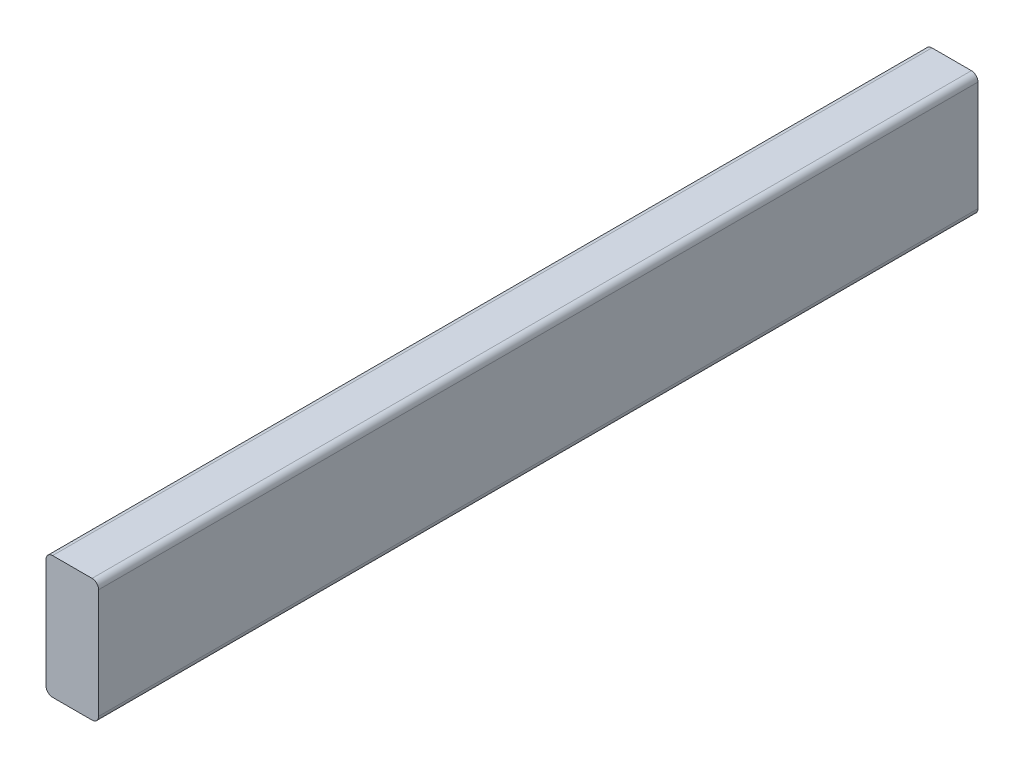
ISO-10303-21;
HEADER;
FILE_DESCRIPTION(('STEP AP214'),'2;1');
FILE_NAME('part.step','',(''),(''),'','','');
FILE_SCHEMA(('AUTOMOTIVE_DESIGN { 1 0 10303 214 1 1 1 1 }'));
ENDSEC;
DATA;
#1=APPLICATION_CONTEXT('core data for automotive mechanical design processes');
#2=APPLICATION_PROTOCOL_DEFINITION('international standard','automotive_design',2000,#1);
#3=PRODUCT_CONTEXT('',#1,'mechanical');
#4=PRODUCT('Part','Part','',(#3));
#5=PRODUCT_RELATED_PRODUCT_CATEGORY('part','',(#4));
#6=PRODUCT_DEFINITION_FORMATION('','',#4);
#7=PRODUCT_DEFINITION_CONTEXT('part definition',#1,'design');
#8=PRODUCT_DEFINITION('design','',#6,#7);
#9=PRODUCT_DEFINITION_SHAPE('','',#8);
#10=(LENGTH_UNIT() NAMED_UNIT(*) SI_UNIT(.MILLI.,.METRE.));
#11=(NAMED_UNIT(*) PLANE_ANGLE_UNIT() SI_UNIT($,.RADIAN.));
#12=(NAMED_UNIT(*) SI_UNIT($,.STERADIAN.) SOLID_ANGLE_UNIT());
#13=UNCERTAINTY_MEASURE_WITH_UNIT(LENGTH_MEASURE(1.E-05),#10,'distance_accuracy_value','');
#14=(GEOMETRIC_REPRESENTATION_CONTEXT(3) GLOBAL_UNCERTAINTY_ASSIGNED_CONTEXT((#13)) GLOBAL_UNIT_ASSIGNED_CONTEXT((#10,
#11,#12)) REPRESENTATION_CONTEXT('',''));
#15=CARTESIAN_POINT('',(0.,0.,0.));
#16=DIRECTION('',(0.,0.,1.));
#17=DIRECTION('',(1.,0.,0.));
#18=AXIS2_PLACEMENT_3D('',#15,#16,#17);
#19=CARTESIAN_POINT('',(-819.830594651005,100.80625,-733.389526516131));
#20=DIRECTION('',(-1.,0.,0.));
#21=DIRECTION('',(0.,0.,1.));
#22=AXIS2_PLACEMENT_3D('',#19,#20,#21);
#23=PLANE('',#22);
#24=DIRECTION('',(0.,1.,0.));
#25=VECTOR('',#24,1.);
#26=CARTESIAN_POINT('',(-819.830594651005,11.90625,-636.66920807166));
#27=LINE('',#26,#25);
#28=CARTESIAN_POINT('',(-819.830594651005,16.66875,-636.66920807166));
#29=VERTEX_POINT('',#28);
#30=CARTESIAN_POINT('',(-819.830594651005,96.04375,-636.66920807166));
#31=VERTEX_POINT('',#30);
#32=EDGE_CURVE('E107',#29,#31,#27,.T.);
#33=ORIENTED_EDGE('',*,*,#32,.F.);
#34=DIRECTION('',(0.,0.,1.));
#35=VECTOR('',#34,1.);
#36=CARTESIAN_POINT('',(-819.830594651005,16.66875,-733.389526516131));
#37=LINE('',#36,#35);
#38=CARTESIAN_POINT('',(-819.830594651005,16.66875,0.));
#39=VERTEX_POINT('',#38);
#40=EDGE_CURVE('E120',#29,#39,#37,.T.);
#41=ORIENTED_EDGE('',*,*,#40,.T.);
#42=DIRECTION('',(0.,-1.,0.));
#43=VECTOR('',#42,1.);
#44=CARTESIAN_POINT('',(-819.830594651005,100.80625,0.));
#45=LINE('',#44,#43);
#46=CARTESIAN_POINT('',(-819.830594651005,96.04375,0.));
#47=VERTEX_POINT('',#46);
#48=EDGE_CURVE('E170',#47,#39,#45,.T.);
#49=ORIENTED_EDGE('',*,*,#48,.F.);
#50=DIRECTION('',(0.,0.,1.));
#51=VECTOR('',#50,1.);
#52=CARTESIAN_POINT('',(-819.830594651005,96.04375,-733.389526516131));
#53=LINE('',#52,#51);
#54=EDGE_CURVE('E123',#47,#31,#53,.F.);
#55=ORIENTED_EDGE('',*,*,#54,.T.);
#56=EDGE_LOOP('',(#33,#41,#49,#55));
#57=FACE_BOUND('',#56,.T.);
#58=ADVANCED_FACE('F37',(#57),#23,.T.);
#59=CARTESIAN_POINT('',(-819.830594651005,100.80625,-733.389526516131));
#60=DIRECTION('',(0.,1.,0.));
#61=DIRECTION('',(0.,0.,1.));
#62=AXIS2_PLACEMENT_3D('',#59,#60,#61);
#63=PLANE('',#62);
#64=DIRECTION('',(1.,0.,0.));
#65=VECTOR('',#64,1.);
#66=CARTESIAN_POINT('',(-819.830594651005,100.80625,-636.66920807166));
#67=LINE('',#66,#65);
#68=CARTESIAN_POINT('',(-815.068094651005,100.80625,-636.66920807166));
#69=VERTEX_POINT('',#68);
#70=CARTESIAN_POINT('',(-786.493094651005,100.80625,-636.66920807166));
#71=VERTEX_POINT('',#70);
#72=EDGE_CURVE('E124',#69,#71,#67,.T.);
#73=ORIENTED_EDGE('',*,*,#72,.F.);
#74=DIRECTION('',(0.,0.,1.));
#75=VECTOR('',#74,1.);
#76=CARTESIAN_POINT('',(-815.068094651005,100.80625,-733.389526516131));
#77=LINE('',#76,#75);
#78=CARTESIAN_POINT('',(-815.068094651005,100.80625,0.));
#79=VERTEX_POINT('',#78);
#80=EDGE_CURVE('E11',#69,#79,#77,.T.);
#81=ORIENTED_EDGE('',*,*,#80,.T.);
#82=DIRECTION('',(-1.,0.,0.));
#83=VECTOR('',#82,1.);
#84=CARTESIAN_POINT('',(-819.830594651005,100.80625,0.));
#85=LINE('',#84,#83);
#86=CARTESIAN_POINT('',(-786.493094651005,100.80625,0.));
#87=VERTEX_POINT('',#86);
#88=EDGE_CURVE('E125',#87,#79,#85,.T.);
#89=ORIENTED_EDGE('',*,*,#88,.F.);
#90=DIRECTION('',(0.,0.,1.));
#91=VECTOR('',#90,1.);
#92=CARTESIAN_POINT('',(-786.493094651005,100.80625,-733.389526516131));
#93=LINE('',#92,#91);
#94=EDGE_CURVE('E45',#87,#71,#93,.F.);
#95=ORIENTED_EDGE('',*,*,#94,.T.);
#96=EDGE_LOOP('',(#73,#81,#89,#95));
#97=FACE_BOUND('',#96,.T.);
#98=ADVANCED_FACE('F154',(#97),#63,.T.);
#99=CARTESIAN_POINT('',(-781.730594651005,100.80625,-733.389526516131));
#100=DIRECTION('',(1.,0.,0.));
#101=DIRECTION('',(0.,0.,-1.));
#102=AXIS2_PLACEMENT_3D('',#99,#100,#101);
#103=PLANE('',#102);
#104=DIRECTION('',(0.,1.,0.));
#105=VECTOR('',#104,1.);
#106=CARTESIAN_POINT('',(-781.730594651005,100.80625,0.));
#107=LINE('',#106,#105);
#108=CARTESIAN_POINT('',(-781.730594651005,16.66875,0.));
#109=VERTEX_POINT('',#108);
#110=CARTESIAN_POINT('',(-781.730594651005,96.04375,0.));
#111=VERTEX_POINT('',#110);
#112=EDGE_CURVE('E163',#109,#111,#107,.T.);
#113=ORIENTED_EDGE('',*,*,#112,.F.);
#114=DIRECTION('',(0.,0.,1.));
#115=VECTOR('',#114,1.);
#116=CARTESIAN_POINT('',(-781.730594651005,16.66875,-733.389526516131));
#117=LINE('',#116,#115);
#118=CARTESIAN_POINT('',(-781.730594651005,16.66875,-636.66920807166));
#119=VERTEX_POINT('',#118);
#120=EDGE_CURVE('E52',#109,#119,#117,.F.);
#121=ORIENTED_EDGE('',*,*,#120,.T.);
#122=DIRECTION('',(0.,-1.,0.));
#123=VECTOR('',#122,1.);
#124=CARTESIAN_POINT('',(-781.730594651005,11.90625,-636.66920807166));
#125=LINE('',#124,#123);
#126=CARTESIAN_POINT('',(-781.730594651005,96.04375,-636.66920807166));
#127=VERTEX_POINT('',#126);
#128=EDGE_CURVE('E158',#127,#119,#125,.T.);
#129=ORIENTED_EDGE('',*,*,#128,.F.);
#130=DIRECTION('',(0.,0.,1.));
#131=VECTOR('',#130,1.);
#132=CARTESIAN_POINT('',(-781.730594651005,96.04375,-733.389526516131));
#133=LINE('',#132,#131);
#134=EDGE_CURVE('E114',#127,#111,#133,.T.);
#135=ORIENTED_EDGE('',*,*,#134,.T.);
#136=EDGE_LOOP('',(#113,#121,#129,#135));
#137=FACE_BOUND('',#136,.T.);
#138=ADVANCED_FACE('F162',(#137),#103,.T.);
#139=CARTESIAN_POINT('',(-819.830594651005,11.90625,-733.389526516131));
#140=DIRECTION('',(0.,-1.,0.));
#141=DIRECTION('',(0.,0.,-1.));
#142=AXIS2_PLACEMENT_3D('',#139,#140,#141);
#143=PLANE('',#142);
#144=DIRECTION('',(1.,0.,0.));
#145=VECTOR('',#144,1.);
#146=CARTESIAN_POINT('',(-819.830594651005,11.90625,0.));
#147=LINE('',#146,#145);
#148=CARTESIAN_POINT('',(-815.068094651005,11.90625,0.));
#149=VERTEX_POINT('',#148);
#150=CARTESIAN_POINT('',(-786.493094651005,11.90625,0.));
#151=VERTEX_POINT('',#150);
#152=EDGE_CURVE('E167',#149,#151,#147,.T.);
#153=ORIENTED_EDGE('',*,*,#152,.F.);
#154=DIRECTION('',(0.,0.,1.));
#155=VECTOR('',#154,1.);
#156=CARTESIAN_POINT('',(-815.068094651005,11.90625,-733.389526516131));
#157=LINE('',#156,#155);
#158=CARTESIAN_POINT('',(-815.068094651005,11.90625,-636.66920807166));
#159=VERTEX_POINT('',#158);
#160=EDGE_CURVE('E142',#149,#159,#157,.F.);
#161=ORIENTED_EDGE('',*,*,#160,.T.);
#162=DIRECTION('',(-1.,0.,0.));
#163=VECTOR('',#162,1.);
#164=CARTESIAN_POINT('',(-819.830594651005,11.90625,-636.66920807166));
#165=LINE('',#164,#163);
#166=CARTESIAN_POINT('',(-786.493094651005,11.90625,-636.66920807166));
#167=VERTEX_POINT('',#166);
#168=EDGE_CURVE('E110',#167,#159,#165,.T.);
#169=ORIENTED_EDGE('',*,*,#168,.F.);
#170=DIRECTION('',(0.,0.,1.));
#171=VECTOR('',#170,1.);
#172=CARTESIAN_POINT('',(-786.493094651005,11.90625,-733.389526516131));
#173=LINE('',#172,#171);
#174=EDGE_CURVE('E139',#167,#151,#173,.T.);
#175=ORIENTED_EDGE('',*,*,#174,.T.);
#176=EDGE_LOOP('',(#153,#161,#169,#175));
#177=FACE_BOUND('',#176,.T.);
#178=ADVANCED_FACE('F181',(#177),#143,.T.);
#179=CARTESIAN_POINT('',(0.,0.,0.));
#180=DIRECTION('',(0.,0.,1.));
#181=DIRECTION('',(1.,0.,0.));
#182=AXIS2_PLACEMENT_3D('',#179,#180,#181);
#183=PLANE('',#182);
#184=ORIENTED_EDGE('',*,*,#48,.T.);
#185=CARTESIAN_POINT('',(-815.068094651005,16.66875,0.));
#186=DIRECTION('',(0.,0.,1.));
#187=DIRECTION('',(1.,0.,0.));
#188=AXIS2_PLACEMENT_3D('',#185,#186,#187);
#189=CIRCLE('',#188,4.7625);
#190=EDGE_CURVE('E128',#39,#149,#189,.T.);
#191=ORIENTED_EDGE('',*,*,#190,.T.);
#192=ORIENTED_EDGE('',*,*,#152,.T.);
#193=CARTESIAN_POINT('',(-786.493094651005,16.66875,0.));
#194=DIRECTION('',(0.,0.,1.));
#195=DIRECTION('',(1.,0.,0.));
#196=AXIS2_PLACEMENT_3D('',#193,#194,#195);
#197=CIRCLE('',#196,4.7625);
#198=EDGE_CURVE('E136',#151,#109,#197,.T.);
#199=ORIENTED_EDGE('',*,*,#198,.T.);
#200=ORIENTED_EDGE('',*,*,#112,.T.);
#201=CARTESIAN_POINT('',(-786.493094651005,96.04375,0.));
#202=DIRECTION('',(0.,0.,1.));
#203=DIRECTION('',(1.,0.,0.));
#204=AXIS2_PLACEMENT_3D('',#201,#202,#203);
#205=CIRCLE('',#204,4.7625);
#206=EDGE_CURVE('E129',#111,#87,#205,.T.);
#207=ORIENTED_EDGE('',*,*,#206,.T.);
#208=ORIENTED_EDGE('',*,*,#88,.T.);
#209=CARTESIAN_POINT('',(-815.068094651005,96.04375,0.));
#210=DIRECTION('',(0.,0.,1.));
#211=DIRECTION('',(1.,0.,0.));
#212=AXIS2_PLACEMENT_3D('',#209,#210,#211);
#213=CIRCLE('',#212,4.7625);
#214=EDGE_CURVE('E131',#79,#47,#213,.T.);
#215=ORIENTED_EDGE('',*,*,#214,.T.);
#216=EDGE_LOOP('',(#184,#191,#192,#199,#200,#207,#208,#215));
#217=FACE_BOUND('',#216,.T.);
#218=ADVANCED_FACE('F165',(#217),#183,.T.);
#219=CARTESIAN_POINT('',(0.,0.,-636.66920807166));
#220=DIRECTION('',(0.,0.,1.));
#221=DIRECTION('',(-1.,0.,0.));
#222=AXIS2_PLACEMENT_3D('',#219,#220,#221);
#223=PLANE('',#222);
#224=ORIENTED_EDGE('',*,*,#168,.T.);
#225=CARTESIAN_POINT('',(-815.068094651005,16.66875,-636.66920807166));
#226=DIRECTION('',(0.,0.,1.));
#227=DIRECTION('',(1.,0.,0.));
#228=AXIS2_PLACEMENT_3D('',#225,#226,#227);
#229=CIRCLE('',#228,4.7625);
#230=EDGE_CURVE('E104',#159,#29,#229,.F.);
#231=ORIENTED_EDGE('',*,*,#230,.T.);
#232=ORIENTED_EDGE('',*,*,#32,.T.);
#233=CARTESIAN_POINT('',(-815.068094651005,96.04375,-636.66920807166));
#234=DIRECTION('',(0.,0.,1.));
#235=DIRECTION('',(1.,0.,0.));
#236=AXIS2_PLACEMENT_3D('',#233,#234,#235);
#237=CIRCLE('',#236,4.7625);
#238=EDGE_CURVE('E145',#31,#69,#237,.F.);
#239=ORIENTED_EDGE('',*,*,#238,.T.);
#240=ORIENTED_EDGE('',*,*,#72,.T.);
#241=CARTESIAN_POINT('',(-786.493094651005,96.04375,-636.66920807166));
#242=DIRECTION('',(0.,0.,1.));
#243=DIRECTION('',(1.,0.,0.));
#244=AXIS2_PLACEMENT_3D('',#241,#242,#243);
#245=CIRCLE('',#244,4.7625);
#246=EDGE_CURVE('E59',#71,#127,#245,.F.);
#247=ORIENTED_EDGE('',*,*,#246,.T.);
#248=ORIENTED_EDGE('',*,*,#128,.T.);
#249=CARTESIAN_POINT('',(-786.493094651005,16.66875,-636.66920807166));
#250=DIRECTION('',(0.,0.,1.));
#251=DIRECTION('',(1.,0.,0.));
#252=AXIS2_PLACEMENT_3D('',#249,#250,#251);
#253=CIRCLE('',#252,4.7625);
#254=EDGE_CURVE('E115',#119,#167,#253,.F.);
#255=ORIENTED_EDGE('',*,*,#254,.T.);
#256=EDGE_LOOP('',(#224,#231,#232,#239,#240,#247,#248,#255));
#257=FACE_BOUND('',#256,.T.);
#258=ADVANCED_FACE('F106',(#257),#223,.F.);
#259=CARTESIAN_POINT('',(-815.068094651005,16.66875,-733.389526516131));
#260=DIRECTION('',(0.,0.,1.));
#261=DIRECTION('',(1.,0.,0.));
#262=AXIS2_PLACEMENT_3D('',#259,#260,#261);
#263=CYLINDRICAL_SURFACE('',#262,4.7625);
#264=ORIENTED_EDGE('',*,*,#230,.F.);
#265=ORIENTED_EDGE('',*,*,#160,.F.);
#266=ORIENTED_EDGE('',*,*,#190,.F.);
#267=ORIENTED_EDGE('',*,*,#40,.F.);
#268=EDGE_LOOP('',(#264,#265,#266,#267));
#269=FACE_BOUND('',#268,.T.);
#270=ADVANCED_FACE('F127',(#269),#263,.T.);
#271=CARTESIAN_POINT('',(-786.493094651005,16.66875,-733.389526516131));
#272=DIRECTION('',(0.,0.,1.));
#273=DIRECTION('',(1.,0.,0.));
#274=AXIS2_PLACEMENT_3D('',#271,#272,#273);
#275=CYLINDRICAL_SURFACE('',#274,4.7625);
#276=ORIENTED_EDGE('',*,*,#254,.F.);
#277=ORIENTED_EDGE('',*,*,#120,.F.);
#278=ORIENTED_EDGE('',*,*,#198,.F.);
#279=ORIENTED_EDGE('',*,*,#174,.F.);
#280=EDGE_LOOP('',(#276,#277,#278,#279));
#281=FACE_BOUND('',#280,.T.);
#282=ADVANCED_FACE('F178',(#281),#275,.T.);
#283=CARTESIAN_POINT('',(-815.068094651005,96.04375,-733.389526516131));
#284=DIRECTION('',(0.,0.,1.));
#285=DIRECTION('',(1.,0.,0.));
#286=AXIS2_PLACEMENT_3D('',#283,#284,#285);
#287=CYLINDRICAL_SURFACE('',#286,4.7625);
#288=ORIENTED_EDGE('',*,*,#238,.F.);
#289=ORIENTED_EDGE('',*,*,#54,.F.);
#290=ORIENTED_EDGE('',*,*,#214,.F.);
#291=ORIENTED_EDGE('',*,*,#80,.F.);
#292=EDGE_LOOP('',(#288,#289,#290,#291));
#293=FACE_BOUND('',#292,.T.);
#294=ADVANCED_FACE('F183',(#293),#287,.T.);
#295=CARTESIAN_POINT('',(-786.493094651005,96.04375,-733.389526516131));
#296=DIRECTION('',(0.,0.,1.));
#297=DIRECTION('',(1.,0.,0.));
#298=AXIS2_PLACEMENT_3D('',#295,#296,#297);
#299=CYLINDRICAL_SURFACE('',#298,4.7625);
#300=ORIENTED_EDGE('',*,*,#246,.F.);
#301=ORIENTED_EDGE('',*,*,#94,.F.);
#302=ORIENTED_EDGE('',*,*,#206,.F.);
#303=ORIENTED_EDGE('',*,*,#134,.F.);
#304=EDGE_LOOP('',(#300,#301,#302,#303));
#305=FACE_BOUND('',#304,.T.);
#306=ADVANCED_FACE('F39',(#305),#299,.T.);
#307=CLOSED_SHELL('',(#58,#98,#138,#178,#218,#258,#270,#282,#294,#306));
#308=MANIFOLD_SOLID_BREP('B2',#307);
#309=ADVANCED_BREP_SHAPE_REPRESENTATION('',(#18,#308),#14);
#310=SHAPE_DEFINITION_REPRESENTATION(#9,#309);
ENDSEC;
END-ISO-10303-21;
